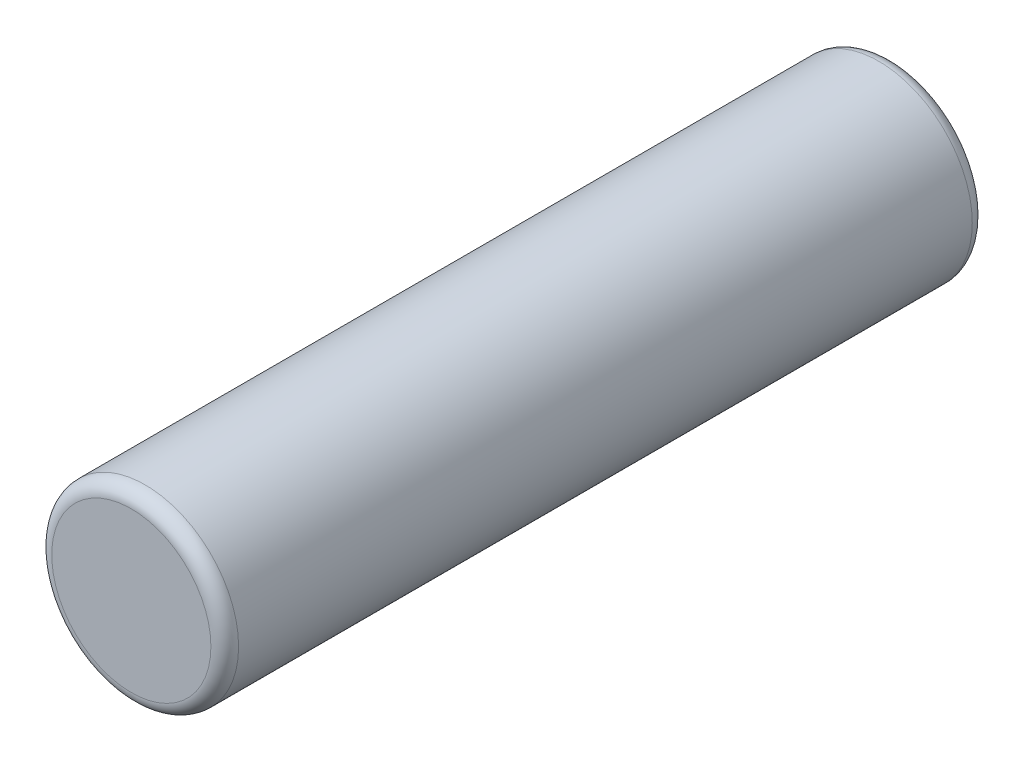
ISO-10303-21;
HEADER;
FILE_DESCRIPTION(('STEP AP214'),'2;1');
FILE_NAME('part.step','',(''),(''),'','','');
FILE_SCHEMA(('AUTOMOTIVE_DESIGN { 1 0 10303 214 1 1 1 1 }'));
ENDSEC;
DATA;
#1=APPLICATION_CONTEXT('core data for automotive mechanical design processes');
#2=APPLICATION_PROTOCOL_DEFINITION('international standard','automotive_design',2000,#1);
#3=PRODUCT_CONTEXT('',#1,'mechanical');
#4=PRODUCT('Part','Part','',(#3));
#5=PRODUCT_RELATED_PRODUCT_CATEGORY('part','',(#4));
#6=PRODUCT_DEFINITION_FORMATION('','',#4);
#7=PRODUCT_DEFINITION_CONTEXT('part definition',#1,'design');
#8=PRODUCT_DEFINITION('design','',#6,#7);
#9=PRODUCT_DEFINITION_SHAPE('','',#8);
#10=(LENGTH_UNIT() NAMED_UNIT(*) SI_UNIT(.MILLI.,.METRE.));
#11=(NAMED_UNIT(*) PLANE_ANGLE_UNIT() SI_UNIT($,.RADIAN.));
#12=(NAMED_UNIT(*) SI_UNIT($,.STERADIAN.) SOLID_ANGLE_UNIT());
#13=UNCERTAINTY_MEASURE_WITH_UNIT(LENGTH_MEASURE(1.E-05),#10,'distance_accuracy_value','');
#14=(GEOMETRIC_REPRESENTATION_CONTEXT(3) GLOBAL_UNCERTAINTY_ASSIGNED_CONTEXT((#13)) GLOBAL_UNIT_ASSIGNED_CONTEXT((#10,
#11,#12)) REPRESENTATION_CONTEXT('',''));
#15=CARTESIAN_POINT('',(0.,0.,0.));
#16=DIRECTION('',(0.,0.,1.));
#17=DIRECTION('',(1.,0.,0.));
#18=AXIS2_PLACEMENT_3D('',#15,#16,#17);
#19=CARTESIAN_POINT('',(0.,0.,110.));
#20=DIRECTION('',(0.,0.,-1.));
#21=DIRECTION('',(-1.,0.,0.));
#22=AXIS2_PLACEMENT_3D('',#19,#20,#21);
#23=CYLINDRICAL_SURFACE('',#22,13.5);
#24=CARTESIAN_POINT('',(0.,0.,2.));
#25=DIRECTION('',(0.,0.,1.));
#26=DIRECTION('',(1.,0.,0.));
#27=AXIS2_PLACEMENT_3D('',#24,#25,#26);
#28=CIRCLE('',#27,13.5);
#29=CARTESIAN_POINT('',(13.5,0.,2.));
#30=VERTEX_POINT('',#29);
#31=EDGE_CURVE('E43',#30,#30,#28,.T.);
#32=ORIENTED_EDGE('',*,*,#31,.T.);
#33=EDGE_LOOP('',(#32));
#34=FACE_BOUND('',#33,.T.);
#35=CARTESIAN_POINT('',(0.,0.,108.));
#36=DIRECTION('',(0.,0.,1.));
#37=DIRECTION('',(1.,0.,0.));
#38=AXIS2_PLACEMENT_3D('',#35,#36,#37);
#39=CIRCLE('',#38,13.5);
#40=CARTESIAN_POINT('',(13.5,0.,108.));
#41=VERTEX_POINT('',#40);
#42=EDGE_CURVE('E47',#41,#41,#39,.F.);
#43=ORIENTED_EDGE('',*,*,#42,.T.);
#44=EDGE_LOOP('',(#43));
#45=FACE_BOUND('',#44,.T.);
#46=ADVANCED_FACE('F36',(#34,#45),#23,.T.);
#47=CARTESIAN_POINT('',(0.,0.,110.));
#48=DIRECTION('',(0.,0.,1.));
#49=DIRECTION('',(1.,0.,0.));
#50=AXIS2_PLACEMENT_3D('',#47,#48,#49);
#51=PLANE('',#50);
#52=CARTESIAN_POINT('',(0.,0.,110.));
#53=DIRECTION('',(0.,0.,1.));
#54=DIRECTION('',(1.,0.,0.));
#55=AXIS2_PLACEMENT_3D('',#52,#53,#54);
#56=CIRCLE('',#55,11.5);
#57=CARTESIAN_POINT('',(11.5,0.,110.));
#58=VERTEX_POINT('',#57);
#59=EDGE_CURVE('E51',#58,#58,#56,.T.);
#60=ORIENTED_EDGE('',*,*,#59,.T.);
#61=EDGE_LOOP('',(#60));
#62=FACE_BOUND('',#61,.T.);
#63=ADVANCED_FACE('F57',(#62),#51,.T.);
#64=CARTESIAN_POINT('',(0.,0.,0.));
#65=DIRECTION('',(0.,0.,1.));
#66=DIRECTION('',(1.,0.,0.));
#67=AXIS2_PLACEMENT_3D('',#64,#65,#66);
#68=PLANE('',#67);
#69=CARTESIAN_POINT('',(0.,0.,0.));
#70=DIRECTION('',(0.,0.,1.));
#71=DIRECTION('',(1.,0.,0.));
#72=AXIS2_PLACEMENT_3D('',#69,#70,#71);
#73=CIRCLE('',#72,11.5);
#74=CARTESIAN_POINT('',(11.5,0.,0.));
#75=VERTEX_POINT('',#74);
#76=EDGE_CURVE('E10',#75,#75,#73,.F.);
#77=ORIENTED_EDGE('',*,*,#76,.T.);
#78=EDGE_LOOP('',(#77));
#79=FACE_BOUND('',#78,.T.);
#80=ADVANCED_FACE('F61',(#79),#68,.F.);
#81=CARTESIAN_POINT('',(0.,0.,108.));
#82=DIRECTION('',(0.,0.,1.));
#83=DIRECTION('',(1.,0.,0.));
#84=AXIS2_PLACEMENT_3D('',#81,#82,#83);
#85=TOROIDAL_SURFACE('',#84,11.5,2.);
#86=ORIENTED_EDGE('',*,*,#42,.F.);
#87=EDGE_LOOP('',(#86));
#88=FACE_BOUND('',#87,.T.);
#89=ORIENTED_EDGE('',*,*,#59,.F.);
#90=EDGE_LOOP('',(#89));
#91=FACE_BOUND('',#90,.T.);
#92=ADVANCED_FACE('F59',(#88,#91),#85,.T.);
#93=CARTESIAN_POINT('',(0.,0.,2.));
#94=DIRECTION('',(0.,0.,1.));
#95=DIRECTION('',(1.,0.,0.));
#96=AXIS2_PLACEMENT_3D('',#93,#94,#95);
#97=TOROIDAL_SURFACE('',#96,11.5,2.);
#98=ORIENTED_EDGE('',*,*,#76,.F.);
#99=EDGE_LOOP('',(#98));
#100=FACE_BOUND('',#99,.T.);
#101=ORIENTED_EDGE('',*,*,#31,.F.);
#102=EDGE_LOOP('',(#101));
#103=FACE_BOUND('',#102,.T.);
#104=ADVANCED_FACE('F38',(#100,#103),#97,.T.);
#105=CLOSED_SHELL('',(#46,#63,#80,#92,#104));
#106=MANIFOLD_SOLID_BREP('B2',#105);
#107=ADVANCED_BREP_SHAPE_REPRESENTATION('',(#18,#106),#14);
#108=SHAPE_DEFINITION_REPRESENTATION(#9,#107);
ENDSEC;
END-ISO-10303-21;
